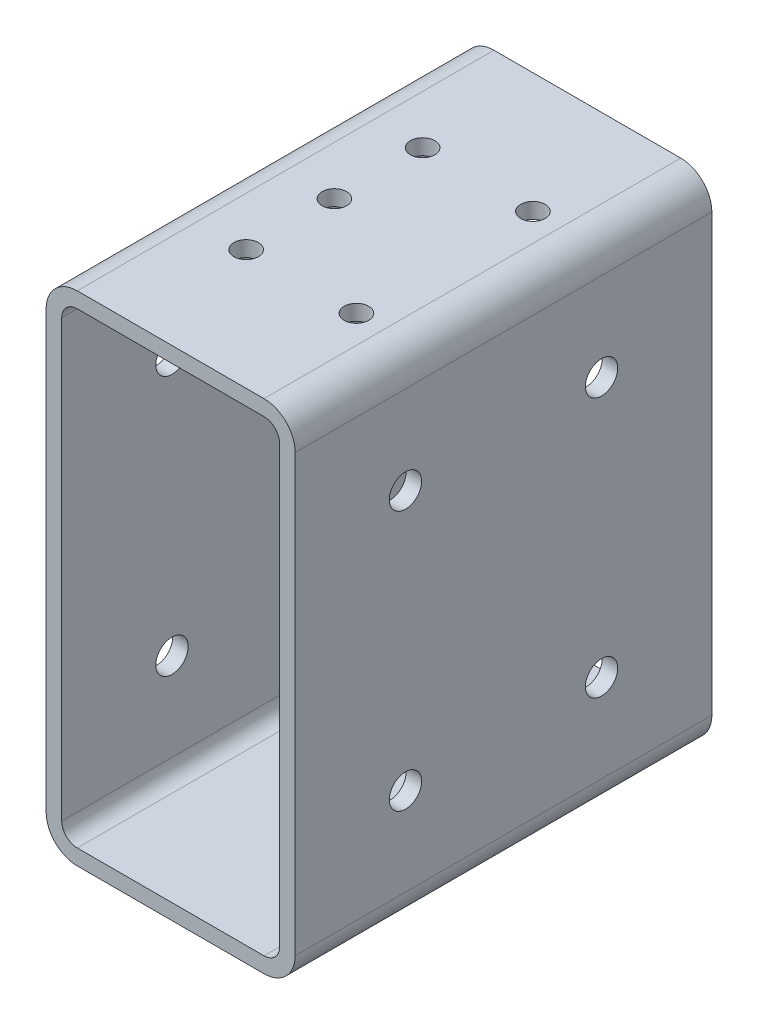
ISO-10303-21;
HEADER;
FILE_DESCRIPTION(('STEP AP214'),'2;1');
FILE_NAME('part.step','',(''),(''),'','','');
FILE_SCHEMA(('AUTOMOTIVE_DESIGN { 1 0 10303 214 1 1 1 1 }'));
ENDSEC;
DATA;
#1=APPLICATION_CONTEXT('core data for automotive mechanical design processes');
#2=APPLICATION_PROTOCOL_DEFINITION('international standard','automotive_design',2000,#1);
#3=PRODUCT_CONTEXT('',#1,'mechanical');
#4=PRODUCT('Part','Part','',(#3));
#5=PRODUCT_RELATED_PRODUCT_CATEGORY('part','',(#4));
#6=PRODUCT_DEFINITION_FORMATION('','',#4);
#7=PRODUCT_DEFINITION_CONTEXT('part definition',#1,'design');
#8=PRODUCT_DEFINITION('design','',#6,#7);
#9=PRODUCT_DEFINITION_SHAPE('','',#8);
#10=(LENGTH_UNIT() NAMED_UNIT(*) SI_UNIT(.MILLI.,.METRE.));
#11=(NAMED_UNIT(*) PLANE_ANGLE_UNIT() SI_UNIT($,.RADIAN.));
#12=(NAMED_UNIT(*) SI_UNIT($,.STERADIAN.) SOLID_ANGLE_UNIT());
#13=UNCERTAINTY_MEASURE_WITH_UNIT(LENGTH_MEASURE(1.E-05),#10,'distance_accuracy_value','');
#14=(GEOMETRIC_REPRESENTATION_CONTEXT(3) GLOBAL_UNCERTAINTY_ASSIGNED_CONTEXT((#13)) GLOBAL_UNIT_ASSIGNED_CONTEXT((#10,
#11,#12)) REPRESENTATION_CONTEXT('',''));
#15=CARTESIAN_POINT('',(0.,0.,0.));
#16=DIRECTION('',(0.,0.,1.));
#17=DIRECTION('',(1.,0.,0.));
#18=AXIS2_PLACEMENT_3D('',#15,#16,#17);
#19=CARTESIAN_POINT('',(-19.05,-44.45,-42.5));
#20=DIRECTION('',(0.,0.,1.));
#21=DIRECTION('',(1.,0.,0.));
#22=AXIS2_PLACEMENT_3D('',#19,#20,#21);
#23=CYLINDRICAL_SURFACE('',#22,3.175);
#24=CARTESIAN_POINT('',(-19.05,-44.45,42.5));
#25=DIRECTION('',(0.,0.,-1.));
#26=DIRECTION('',(-1.,0.,0.));
#27=AXIS2_PLACEMENT_3D('',#24,#25,#26);
#28=CIRCLE('',#27,3.175);
#29=CARTESIAN_POINT('',(-19.05,-47.625,42.5));
#30=VERTEX_POINT('',#29);
#31=CARTESIAN_POINT('',(-22.225,-44.45,42.5));
#32=VERTEX_POINT('',#31);
#33=EDGE_CURVE('E231',#30,#32,#28,.T.);
#34=ORIENTED_EDGE('',*,*,#33,.F.);
#35=DIRECTION('',(0.,0.,1.));
#36=VECTOR('',#35,1.);
#37=CARTESIAN_POINT('',(-19.05,-47.625,-42.5));
#38=LINE('',#37,#36);
#39=CARTESIAN_POINT('',(-19.05,-47.625,-42.5));
#40=VERTEX_POINT('',#39);
#41=EDGE_CURVE('E12',#40,#30,#38,.T.);
#42=ORIENTED_EDGE('',*,*,#41,.F.);
#43=CARTESIAN_POINT('',(-19.05,-44.45,-42.5));
#44=DIRECTION('',(0.,0.,-1.));
#45=DIRECTION('',(-1.,0.,0.));
#46=AXIS2_PLACEMENT_3D('',#43,#44,#45);
#47=CIRCLE('',#46,3.175);
#48=CARTESIAN_POINT('',(-22.225,-44.45,-42.5));
#49=VERTEX_POINT('',#48);
#50=EDGE_CURVE('E359',#40,#49,#47,.T.);
#51=ORIENTED_EDGE('',*,*,#50,.T.);
#52=DIRECTION('',(0.,0.,1.));
#53=VECTOR('',#52,1.);
#54=CARTESIAN_POINT('',(-22.225,-44.45,-42.5));
#55=LINE('',#54,#53);
#56=EDGE_CURVE('E82',#49,#32,#55,.T.);
#57=ORIENTED_EDGE('',*,*,#56,.T.);
#58=EDGE_LOOP('',(#34,#42,#51,#57));
#59=FACE_BOUND('',#58,.T.);
#60=ADVANCED_FACE('F63',(#59),#23,.F.);
#61=CARTESIAN_POINT('',(-19.05,-47.625,-42.5));
#62=DIRECTION('',(0.,1.,0.));
#63=DIRECTION('',(0.,0.,1.));
#64=AXIS2_PLACEMENT_3D('',#61,#62,#63);
#65=PLANE('',#64);
#66=DIRECTION('',(-1.,0.,0.));
#67=VECTOR('',#66,1.);
#68=CARTESIAN_POINT('',(-19.05,-47.625,42.5));
#69=LINE('',#68,#67);
#70=CARTESIAN_POINT('',(19.05,-47.625,42.5));
#71=VERTEX_POINT('',#70);
#72=EDGE_CURVE('E233',#71,#30,#69,.T.);
#73=ORIENTED_EDGE('',*,*,#72,.F.);
#74=DIRECTION('',(0.,0.,1.));
#75=VECTOR('',#74,1.);
#76=CARTESIAN_POINT('',(19.05,-47.625,-42.5));
#77=LINE('',#76,#75);
#78=CARTESIAN_POINT('',(19.05,-47.625,-42.5));
#79=VERTEX_POINT('',#78);
#80=EDGE_CURVE('E73',#79,#71,#77,.T.);
#81=ORIENTED_EDGE('',*,*,#80,.F.);
#82=DIRECTION('',(-1.,0.,0.));
#83=VECTOR('',#82,1.);
#84=CARTESIAN_POINT('',(-19.05,-47.625,-42.5));
#85=LINE('',#84,#83);
#86=EDGE_CURVE('E361',#79,#40,#85,.T.);
#87=ORIENTED_EDGE('',*,*,#86,.T.);
#88=ORIENTED_EDGE('',*,*,#41,.T.);
#89=EDGE_LOOP('',(#73,#81,#87,#88));
#90=FACE_BOUND('',#89,.T.);
#91=ADVANCED_FACE('F394',(#90),#65,.T.);
#92=CARTESIAN_POINT('',(19.05,-44.45,-42.5));
#93=DIRECTION('',(0.,0.,1.));
#94=DIRECTION('',(1.,0.,0.));
#95=AXIS2_PLACEMENT_3D('',#92,#93,#94);
#96=CYLINDRICAL_SURFACE('',#95,3.175);
#97=CARTESIAN_POINT('',(19.05,-44.45,42.5));
#98=DIRECTION('',(0.,0.,-1.));
#99=DIRECTION('',(-1.,0.,0.));
#100=AXIS2_PLACEMENT_3D('',#97,#98,#99);
#101=CIRCLE('',#100,3.175);
#102=CARTESIAN_POINT('',(22.225,-44.45,42.5));
#103=VERTEX_POINT('',#102);
#104=EDGE_CURVE('E236',#103,#71,#101,.T.);
#105=ORIENTED_EDGE('',*,*,#104,.F.);
#106=DIRECTION('',(0.,0.,1.));
#107=VECTOR('',#106,1.);
#108=CARTESIAN_POINT('',(22.225,-44.45,-42.5));
#109=LINE('',#108,#107);
#110=CARTESIAN_POINT('',(22.225,-44.45,-42.5));
#111=VERTEX_POINT('',#110);
#112=EDGE_CURVE('E258',#111,#103,#109,.T.);
#113=ORIENTED_EDGE('',*,*,#112,.F.);
#114=CARTESIAN_POINT('',(19.05,-44.45,-42.5));
#115=DIRECTION('',(0.,0.,-1.));
#116=DIRECTION('',(-1.,0.,0.));
#117=AXIS2_PLACEMENT_3D('',#114,#115,#116);
#118=CIRCLE('',#117,3.175);
#119=EDGE_CURVE('E364',#111,#79,#118,.T.);
#120=ORIENTED_EDGE('',*,*,#119,.T.);
#121=ORIENTED_EDGE('',*,*,#80,.T.);
#122=EDGE_LOOP('',(#105,#113,#120,#121));
#123=FACE_BOUND('',#122,.T.);
#124=ADVANCED_FACE('F399',(#123),#96,.F.);
#125=CARTESIAN_POINT('',(22.225,44.45,-42.5));
#126=DIRECTION('',(-1.,0.,0.));
#127=DIRECTION('',(0.,-1.,0.));
#128=AXIS2_PLACEMENT_3D('',#125,#126,#127);
#129=PLANE('',#128);
#130=CARTESIAN_POINT('',(22.225,26.5,-20.));
#131=DIRECTION('',(-1.,0.,0.));
#132=DIRECTION('',(0.,-1.,0.));
#133=AXIS2_PLACEMENT_3D('',#130,#131,#132);
#134=CIRCLE('',#133,3.3);
#135=CARTESIAN_POINT('',(22.225,23.2,-20.));
#136=VERTEX_POINT('',#135);
#137=EDGE_CURVE('E306',#136,#136,#134,.T.);
#138=ORIENTED_EDGE('',*,*,#137,.F.);
#139=EDGE_LOOP('',(#138));
#140=FACE_BOUND('',#139,.T.);
#141=CARTESIAN_POINT('',(22.225,-26.5,-20.));
#142=DIRECTION('',(-1.,0.,0.));
#143=DIRECTION('',(0.,-1.,0.));
#144=AXIS2_PLACEMENT_3D('',#141,#142,#143);
#145=CIRCLE('',#144,3.3);
#146=CARTESIAN_POINT('',(22.225,-29.8,-20.));
#147=VERTEX_POINT('',#146);
#148=EDGE_CURVE('E293',#147,#147,#145,.T.);
#149=ORIENTED_EDGE('',*,*,#148,.F.);
#150=EDGE_LOOP('',(#149));
#151=FACE_BOUND('',#150,.T.);
#152=CARTESIAN_POINT('',(22.225,-26.5,20.));
#153=DIRECTION('',(-1.,0.,0.));
#154=DIRECTION('',(0.,-1.,0.));
#155=AXIS2_PLACEMENT_3D('',#152,#153,#154);
#156=CIRCLE('',#155,3.3);
#157=CARTESIAN_POINT('',(22.225,-29.8,20.));
#158=VERTEX_POINT('',#157);
#159=EDGE_CURVE('E289',#158,#158,#156,.T.);
#160=ORIENTED_EDGE('',*,*,#159,.F.);
#161=EDGE_LOOP('',(#160));
#162=FACE_BOUND('',#161,.T.);
#163=CARTESIAN_POINT('',(22.225,26.5,20.));
#164=DIRECTION('',(-1.,0.,0.));
#165=DIRECTION('',(0.,-1.,0.));
#166=AXIS2_PLACEMENT_3D('',#163,#164,#165);
#167=CIRCLE('',#166,3.3);
#168=CARTESIAN_POINT('',(22.225,23.2,20.));
#169=VERTEX_POINT('',#168);
#170=EDGE_CURVE('E285',#169,#169,#167,.T.);
#171=ORIENTED_EDGE('',*,*,#170,.F.);
#172=EDGE_LOOP('',(#171));
#173=FACE_BOUND('',#172,.T.);
#174=DIRECTION('',(0.,-1.,0.));
#175=VECTOR('',#174,1.);
#176=CARTESIAN_POINT('',(22.225,44.45,42.5));
#177=LINE('',#176,#175);
#178=CARTESIAN_POINT('',(22.225,44.45,42.5));
#179=VERTEX_POINT('',#178);
#180=EDGE_CURVE('E239',#179,#103,#177,.T.);
#181=ORIENTED_EDGE('',*,*,#180,.F.);
#182=DIRECTION('',(0.,0.,1.));
#183=VECTOR('',#182,1.);
#184=CARTESIAN_POINT('',(22.225,44.45,-42.5));
#185=LINE('',#184,#183);
#186=CARTESIAN_POINT('',(22.225,44.45,-42.5));
#187=VERTEX_POINT('',#186);
#188=EDGE_CURVE('E256',#187,#179,#185,.T.);
#189=ORIENTED_EDGE('',*,*,#188,.F.);
#190=DIRECTION('',(0.,-1.,0.));
#191=VECTOR('',#190,1.);
#192=CARTESIAN_POINT('',(22.225,44.45,-42.5));
#193=LINE('',#192,#191);
#194=EDGE_CURVE('E367',#187,#111,#193,.T.);
#195=ORIENTED_EDGE('',*,*,#194,.T.);
#196=ORIENTED_EDGE('',*,*,#112,.T.);
#197=EDGE_LOOP('',(#181,#189,#195,#196));
#198=FACE_BOUND('',#197,.T.);
#199=ADVANCED_FACE('F542',(#140,#151,#162,#173,#198),#129,.T.);
#200=CARTESIAN_POINT('',(19.05,44.45,-42.5));
#201=DIRECTION('',(0.,0.,1.));
#202=DIRECTION('',(1.,0.,0.));
#203=AXIS2_PLACEMENT_3D('',#200,#201,#202);
#204=CYLINDRICAL_SURFACE('',#203,3.175);
#205=CARTESIAN_POINT('',(19.05,44.45,42.5));
#206=DIRECTION('',(0.,0.,-1.));
#207=DIRECTION('',(1.,0.,0.));
#208=AXIS2_PLACEMENT_3D('',#205,#206,#207);
#209=CIRCLE('',#208,3.175);
#210=CARTESIAN_POINT('',(19.05,47.625,42.5));
#211=VERTEX_POINT('',#210);
#212=EDGE_CURVE('E242',#211,#179,#209,.T.);
#213=ORIENTED_EDGE('',*,*,#212,.F.);
#214=DIRECTION('',(0.,0.,1.));
#215=VECTOR('',#214,1.);
#216=CARTESIAN_POINT('',(19.05,47.625,-42.5));
#217=LINE('',#216,#215);
#218=CARTESIAN_POINT('',(19.05,47.625,-42.5));
#219=VERTEX_POINT('',#218);
#220=EDGE_CURVE('E193',#219,#211,#217,.T.);
#221=ORIENTED_EDGE('',*,*,#220,.F.);
#222=CARTESIAN_POINT('',(19.05,44.45,-42.5));
#223=DIRECTION('',(0.,0.,-1.));
#224=DIRECTION('',(1.,0.,0.));
#225=AXIS2_PLACEMENT_3D('',#222,#223,#224);
#226=CIRCLE('',#225,3.175);
#227=EDGE_CURVE('E204',#219,#187,#226,.T.);
#228=ORIENTED_EDGE('',*,*,#227,.T.);
#229=ORIENTED_EDGE('',*,*,#188,.T.);
#230=EDGE_LOOP('',(#213,#221,#228,#229));
#231=FACE_BOUND('',#230,.T.);
#232=ADVANCED_FACE('F371',(#231),#204,.F.);
#233=CARTESIAN_POINT('',(-19.05,47.625,-42.5));
#234=DIRECTION('',(0.,-1.,0.));
#235=DIRECTION('',(1.,0.,0.));
#236=AXIS2_PLACEMENT_3D('',#233,#234,#235);
#237=PLANE('',#236);
#238=CARTESIAN_POINT('',(-9.1,47.625,-18.));
#239=DIRECTION('',(0.,-1.,0.));
#240=DIRECTION('',(1.,0.,0.));
#241=AXIS2_PLACEMENT_3D('',#238,#239,#240);
#242=CIRCLE('',#241,2.5);
#243=CARTESIAN_POINT('',(-6.6,47.625,-18.));
#244=VERTEX_POINT('',#243);
#245=EDGE_CURVE('E337',#244,#244,#242,.T.);
#246=ORIENTED_EDGE('',*,*,#245,.F.);
#247=EDGE_LOOP('',(#246));
#248=FACE_BOUND('',#247,.T.);
#249=CARTESIAN_POINT('',(-9.1,47.625,18.));
#250=DIRECTION('',(0.,-1.,0.));
#251=DIRECTION('',(1.,0.,0.));
#252=AXIS2_PLACEMENT_3D('',#249,#250,#251);
#253=CIRCLE('',#252,2.5);
#254=CARTESIAN_POINT('',(-6.6,47.625,18.));
#255=VERTEX_POINT('',#254);
#256=EDGE_CURVE('E334',#255,#255,#253,.T.);
#257=ORIENTED_EDGE('',*,*,#256,.F.);
#258=EDGE_LOOP('',(#257));
#259=FACE_BOUND('',#258,.T.);
#260=CARTESIAN_POINT('',(13.4,47.625,-18.));
#261=DIRECTION('',(0.,-1.,0.));
#262=DIRECTION('',(1.,0.,0.));
#263=AXIS2_PLACEMENT_3D('',#260,#261,#262);
#264=CIRCLE('',#263,2.49999999999999);
#265=CARTESIAN_POINT('',(15.9,47.625,-18.));
#266=VERTEX_POINT('',#265);
#267=EDGE_CURVE('E331',#266,#266,#264,.T.);
#268=ORIENTED_EDGE('',*,*,#267,.F.);
#269=EDGE_LOOP('',(#268));
#270=FACE_BOUND('',#269,.T.);
#271=CARTESIAN_POINT('',(13.4,47.625,18.));
#272=DIRECTION('',(0.,-1.,0.));
#273=DIRECTION('',(1.,0.,0.));
#274=AXIS2_PLACEMENT_3D('',#271,#272,#273);
#275=CIRCLE('',#274,2.49999999999999);
#276=CARTESIAN_POINT('',(15.9,47.625,18.));
#277=VERTEX_POINT('',#276);
#278=EDGE_CURVE('E320',#277,#277,#275,.T.);
#279=ORIENTED_EDGE('',*,*,#278,.F.);
#280=EDGE_LOOP('',(#279));
#281=FACE_BOUND('',#280,.T.);
#282=CARTESIAN_POINT('',(-9.1,47.625,0.));
#283=DIRECTION('',(0.,-1.,0.));
#284=DIRECTION('',(1.,0.,0.));
#285=AXIS2_PLACEMENT_3D('',#282,#283,#284);
#286=CIRCLE('',#285,2.5);
#287=CARTESIAN_POINT('',(-6.60000000000001,47.625,0.));
#288=VERTEX_POINT('',#287);
#289=EDGE_CURVE('E217',#288,#288,#286,.T.);
#290=ORIENTED_EDGE('',*,*,#289,.F.);
#291=EDGE_LOOP('',(#290));
#292=FACE_BOUND('',#291,.T.);
#293=DIRECTION('',(1.,0.,0.));
#294=VECTOR('',#293,1.);
#295=CARTESIAN_POINT('',(-19.05,47.625,42.5));
#296=LINE('',#295,#294);
#297=CARTESIAN_POINT('',(-19.05,47.625,42.5));
#298=VERTEX_POINT('',#297);
#299=EDGE_CURVE('E189',#298,#211,#296,.T.);
#300=ORIENTED_EDGE('',*,*,#299,.F.);
#301=DIRECTION('',(0.,0.,1.));
#302=VECTOR('',#301,1.);
#303=CARTESIAN_POINT('',(-19.05,47.625,-42.5));
#304=LINE('',#303,#302);
#305=CARTESIAN_POINT('',(-19.05,47.625,-42.5));
#306=VERTEX_POINT('',#305);
#307=EDGE_CURVE('E184',#306,#298,#304,.T.);
#308=ORIENTED_EDGE('',*,*,#307,.F.);
#309=DIRECTION('',(1.,0.,0.));
#310=VECTOR('',#309,1.);
#311=CARTESIAN_POINT('',(-19.05,47.625,-42.5));
#312=LINE('',#311,#310);
#313=EDGE_CURVE('E187',#306,#219,#312,.T.);
#314=ORIENTED_EDGE('',*,*,#313,.T.);
#315=ORIENTED_EDGE('',*,*,#220,.T.);
#316=EDGE_LOOP('',(#300,#308,#314,#315));
#317=FACE_BOUND('',#316,.T.);
#318=ADVANCED_FACE('F186',(#248,#259,#270,#281,#292,#317),#237,.T.);
#319=CARTESIAN_POINT('',(-19.05,44.45,-42.5));
#320=DIRECTION('',(0.,0.,1.));
#321=DIRECTION('',(1.,0.,0.));
#322=AXIS2_PLACEMENT_3D('',#319,#320,#321);
#323=CYLINDRICAL_SURFACE('',#322,3.17499999999999);
#324=CARTESIAN_POINT('',(-19.05,44.45,42.5));
#325=DIRECTION('',(0.,0.,-1.));
#326=DIRECTION('',(-1.,0.,0.));
#327=AXIS2_PLACEMENT_3D('',#324,#325,#326);
#328=CIRCLE('',#327,3.17499999999999);
#329=CARTESIAN_POINT('',(-22.225,44.45,42.5));
#330=VERTEX_POINT('',#329);
#331=EDGE_CURVE('E246',#330,#298,#328,.T.);
#332=ORIENTED_EDGE('',*,*,#331,.F.);
#333=DIRECTION('',(0.,0.,1.));
#334=VECTOR('',#333,1.);
#335=CARTESIAN_POINT('',(-22.225,44.45,-42.5));
#336=LINE('',#335,#334);
#337=CARTESIAN_POINT('',(-22.225,44.45,-42.5));
#338=VERTEX_POINT('',#337);
#339=EDGE_CURVE('E131',#338,#330,#336,.T.);
#340=ORIENTED_EDGE('',*,*,#339,.F.);
#341=CARTESIAN_POINT('',(-19.05,44.45,-42.5));
#342=DIRECTION('',(0.,0.,-1.));
#343=DIRECTION('',(-1.,0.,0.));
#344=AXIS2_PLACEMENT_3D('',#341,#342,#343);
#345=CIRCLE('',#344,3.17499999999999);
#346=EDGE_CURVE('E201',#338,#306,#345,.T.);
#347=ORIENTED_EDGE('',*,*,#346,.T.);
#348=ORIENTED_EDGE('',*,*,#307,.T.);
#349=EDGE_LOOP('',(#332,#340,#347,#348));
#350=FACE_BOUND('',#349,.T.);
#351=ADVANCED_FACE('F206',(#350),#323,.F.);
#352=CARTESIAN_POINT('',(-19.05,-44.45,-42.5));
#353=DIRECTION('',(0.,0.,1.));
#354=DIRECTION('',(1.,0.,0.));
#355=AXIS2_PLACEMENT_3D('',#352,#353,#354);
#356=CYLINDRICAL_SURFACE('',#355,6.35);
#357=CARTESIAN_POINT('',(-19.05,-44.45,42.5));
#358=DIRECTION('',(0.,0.,-1.));
#359=DIRECTION('',(1.,0.,0.));
#360=AXIS2_PLACEMENT_3D('',#357,#358,#359);
#361=CIRCLE('',#360,6.35);
#362=CARTESIAN_POINT('',(-19.05,-50.8,42.5));
#363=VERTEX_POINT('',#362);
#364=CARTESIAN_POINT('',(-25.4,-44.45,42.5));
#365=VERTEX_POINT('',#364);
#366=EDGE_CURVE('E213',#363,#365,#361,.T.);
#367=ORIENTED_EDGE('',*,*,#366,.T.);
#368=DIRECTION('',(0.,0.,1.));
#369=VECTOR('',#368,1.);
#370=CARTESIAN_POINT('',(-25.4,-44.45,-42.5));
#371=LINE('',#370,#369);
#372=CARTESIAN_POINT('',(-25.4,-44.45,-42.5));
#373=VERTEX_POINT('',#372);
#374=EDGE_CURVE('E253',#373,#365,#371,.T.);
#375=ORIENTED_EDGE('',*,*,#374,.F.);
#376=CARTESIAN_POINT('',(-19.05,-44.45,-42.5));
#377=DIRECTION('',(0.,0.,-1.));
#378=DIRECTION('',(1.,0.,0.));
#379=AXIS2_PLACEMENT_3D('',#376,#377,#378);
#380=CIRCLE('',#379,6.35);
#381=CARTESIAN_POINT('',(-19.05,-50.8,-42.5));
#382=VERTEX_POINT('',#381);
#383=EDGE_CURVE('E251',#382,#373,#380,.T.);
#384=ORIENTED_EDGE('',*,*,#383,.F.);
#385=DIRECTION('',(0.,0.,1.));
#386=VECTOR('',#385,1.);
#387=CARTESIAN_POINT('',(-19.05,-50.8,-42.5));
#388=LINE('',#387,#386);
#389=EDGE_CURVE('E209',#382,#363,#388,.T.);
#390=ORIENTED_EDGE('',*,*,#389,.T.);
#391=EDGE_LOOP('',(#367,#375,#384,#390));
#392=FACE_BOUND('',#391,.T.);
#393=ADVANCED_FACE('F65',(#392),#356,.T.);
#394=CARTESIAN_POINT('',(-25.4,44.45,-42.5));
#395=DIRECTION('',(1.,0.,0.));
#396=DIRECTION('',(0.,1.,0.));
#397=AXIS2_PLACEMENT_3D('',#394,#395,#396);
#398=PLANE('',#397);
#399=CARTESIAN_POINT('',(-25.4,26.5,-20.));
#400=DIRECTION('',(1.,0.,0.));
#401=DIRECTION('',(0.,1.,0.));
#402=AXIS2_PLACEMENT_3D('',#399,#400,#401);
#403=CIRCLE('',#402,3.3);
#404=CARTESIAN_POINT('',(-25.4,29.8,-20.));
#405=VERTEX_POINT('',#404);
#406=EDGE_CURVE('E290',#405,#405,#403,.T.);
#407=ORIENTED_EDGE('',*,*,#406,.T.);
#408=EDGE_LOOP('',(#407));
#409=FACE_BOUND('',#408,.T.);
#410=CARTESIAN_POINT('',(-25.4,-26.5,-20.));
#411=DIRECTION('',(1.,0.,0.));
#412=DIRECTION('',(0.,1.,0.));
#413=AXIS2_PLACEMENT_3D('',#410,#411,#412);
#414=CIRCLE('',#413,3.3);
#415=CARTESIAN_POINT('',(-25.4,-23.2,-20.));
#416=VERTEX_POINT('',#415);
#417=EDGE_CURVE('E435',#416,#416,#414,.T.);
#418=ORIENTED_EDGE('',*,*,#417,.T.);
#419=EDGE_LOOP('',(#418));
#420=FACE_BOUND('',#419,.T.);
#421=CARTESIAN_POINT('',(-25.4,-26.5,20.));
#422=DIRECTION('',(1.,0.,0.));
#423=DIRECTION('',(0.,1.,0.));
#424=AXIS2_PLACEMENT_3D('',#421,#422,#423);
#425=CIRCLE('',#424,3.3);
#426=CARTESIAN_POINT('',(-25.4,-23.2,20.));
#427=VERTEX_POINT('',#426);
#428=EDGE_CURVE('E439',#427,#427,#425,.T.);
#429=ORIENTED_EDGE('',*,*,#428,.T.);
#430=EDGE_LOOP('',(#429));
#431=FACE_BOUND('',#430,.T.);
#432=CARTESIAN_POINT('',(-25.4,26.5,20.));
#433=DIRECTION('',(1.,0.,0.));
#434=DIRECTION('',(0.,1.,0.));
#435=AXIS2_PLACEMENT_3D('',#432,#433,#434);
#436=CIRCLE('',#435,3.3);
#437=CARTESIAN_POINT('',(-25.4,29.8,20.));
#438=VERTEX_POINT('',#437);
#439=EDGE_CURVE('E286',#438,#438,#436,.T.);
#440=ORIENTED_EDGE('',*,*,#439,.T.);
#441=EDGE_LOOP('',(#440));
#442=FACE_BOUND('',#441,.T.);
#443=DIRECTION('',(0.,1.,0.));
#444=VECTOR('',#443,1.);
#445=CARTESIAN_POINT('',(-25.4,44.45,42.5));
#446=LINE('',#445,#444);
#447=CARTESIAN_POINT('',(-25.4,44.45,42.5));
#448=VERTEX_POINT('',#447);
#449=EDGE_CURVE('E216',#365,#448,#446,.T.);
#450=ORIENTED_EDGE('',*,*,#449,.T.);
#451=DIRECTION('',(0.,0.,1.));
#452=VECTOR('',#451,1.);
#453=CARTESIAN_POINT('',(-25.4,44.45,-42.5));
#454=LINE('',#453,#452);
#455=CARTESIAN_POINT('',(-25.4,44.45,-42.5));
#456=VERTEX_POINT('',#455);
#457=EDGE_CURVE('E278',#456,#448,#454,.T.);
#458=ORIENTED_EDGE('',*,*,#457,.F.);
#459=DIRECTION('',(0.,1.,0.));
#460=VECTOR('',#459,1.);
#461=CARTESIAN_POINT('',(-25.4,44.45,-42.5));
#462=LINE('',#461,#460);
#463=EDGE_CURVE('E144',#373,#456,#462,.T.);
#464=ORIENTED_EDGE('',*,*,#463,.F.);
#465=ORIENTED_EDGE('',*,*,#374,.T.);
#466=EDGE_LOOP('',(#450,#458,#464,#465));
#467=FACE_BOUND('',#466,.T.);
#468=ADVANCED_FACE('F421',(#409,#420,#431,#442,#467),#398,.F.);
#469=CARTESIAN_POINT('',(-19.05,44.45,-42.5));
#470=DIRECTION('',(0.,0.,1.));
#471=DIRECTION('',(1.,0.,0.));
#472=AXIS2_PLACEMENT_3D('',#469,#470,#471);
#473=CYLINDRICAL_SURFACE('',#472,6.35);
#474=CARTESIAN_POINT('',(-19.05,44.45,42.5));
#475=DIRECTION('',(0.,0.,-1.));
#476=DIRECTION('',(-1.,0.,0.));
#477=AXIS2_PLACEMENT_3D('',#474,#475,#476);
#478=CIRCLE('',#477,6.35);
#479=CARTESIAN_POINT('',(-19.05,50.8,42.5));
#480=VERTEX_POINT('',#479);
#481=EDGE_CURVE('E219',#448,#480,#478,.T.);
#482=ORIENTED_EDGE('',*,*,#481,.T.);
#483=DIRECTION('',(0.,0.,1.));
#484=VECTOR('',#483,1.);
#485=CARTESIAN_POINT('',(-19.05,50.8,-42.5));
#486=LINE('',#485,#484);
#487=CARTESIAN_POINT('',(-19.05,50.8,-42.5));
#488=VERTEX_POINT('',#487);
#489=EDGE_CURVE('E275',#488,#480,#486,.T.);
#490=ORIENTED_EDGE('',*,*,#489,.F.);
#491=CARTESIAN_POINT('',(-19.05,44.45,-42.5));
#492=DIRECTION('',(0.,0.,-1.));
#493=DIRECTION('',(-1.,0.,0.));
#494=AXIS2_PLACEMENT_3D('',#491,#492,#493);
#495=CIRCLE('',#494,6.35);
#496=EDGE_CURVE('E347',#456,#488,#495,.T.);
#497=ORIENTED_EDGE('',*,*,#496,.F.);
#498=ORIENTED_EDGE('',*,*,#457,.T.);
#499=EDGE_LOOP('',(#482,#490,#497,#498));
#500=FACE_BOUND('',#499,.T.);
#501=ADVANCED_FACE('F418',(#500),#473,.T.);
#502=CARTESIAN_POINT('',(-19.05,50.8,-42.5));
#503=DIRECTION('',(0.,-1.,0.));
#504=DIRECTION('',(1.,0.,0.));
#505=AXIS2_PLACEMENT_3D('',#502,#503,#504);
#506=PLANE('',#505);
#507=CARTESIAN_POINT('',(-9.1,50.8,-18.));
#508=DIRECTION('',(0.,1.,0.));
#509=DIRECTION('',(-1.,0.,0.));
#510=AXIS2_PLACEMENT_3D('',#507,#508,#509);
#511=CIRCLE('',#510,2.5);
#512=CARTESIAN_POINT('',(-11.6,50.8,-18.));
#513=VERTEX_POINT('',#512);
#514=EDGE_CURVE('E317',#513,#513,#511,.T.);
#515=ORIENTED_EDGE('',*,*,#514,.F.);
#516=EDGE_LOOP('',(#515));
#517=FACE_BOUND('',#516,.T.);
#518=CARTESIAN_POINT('',(-9.1,50.8,18.));
#519=DIRECTION('',(0.,1.,0.));
#520=DIRECTION('',(-1.,0.,0.));
#521=AXIS2_PLACEMENT_3D('',#518,#519,#520);
#522=CIRCLE('',#521,2.5);
#523=CARTESIAN_POINT('',(-11.6,50.8,18.));
#524=VERTEX_POINT('',#523);
#525=EDGE_CURVE('E321',#524,#524,#522,.T.);
#526=ORIENTED_EDGE('',*,*,#525,.F.);
#527=EDGE_LOOP('',(#526));
#528=FACE_BOUND('',#527,.T.);
#529=CARTESIAN_POINT('',(13.4,50.8,-18.));
#530=DIRECTION('',(0.,1.,0.));
#531=DIRECTION('',(-1.,0.,0.));
#532=AXIS2_PLACEMENT_3D('',#529,#530,#531);
#533=CIRCLE('',#532,2.49999999999999);
#534=CARTESIAN_POINT('',(10.9,50.8,-18.));
#535=VERTEX_POINT('',#534);
#536=EDGE_CURVE('E324',#535,#535,#533,.T.);
#537=ORIENTED_EDGE('',*,*,#536,.F.);
#538=EDGE_LOOP('',(#537));
#539=FACE_BOUND('',#538,.T.);
#540=CARTESIAN_POINT('',(13.4,50.8,18.));
#541=DIRECTION('',(0.,1.,0.));
#542=DIRECTION('',(-1.,0.,0.));
#543=AXIS2_PLACEMENT_3D('',#540,#541,#542);
#544=CIRCLE('',#543,2.49999999999999);
#545=CARTESIAN_POINT('',(10.9,50.8,18.));
#546=VERTEX_POINT('',#545);
#547=EDGE_CURVE('E316',#546,#546,#544,.T.);
#548=ORIENTED_EDGE('',*,*,#547,.F.);
#549=EDGE_LOOP('',(#548));
#550=FACE_BOUND('',#549,.T.);
#551=CARTESIAN_POINT('',(-9.1,50.8,0.));
#552=DIRECTION('',(0.,1.,0.));
#553=DIRECTION('',(-1.,0.,0.));
#554=AXIS2_PLACEMENT_3D('',#551,#552,#553);
#555=CIRCLE('',#554,2.5);
#556=CARTESIAN_POINT('',(-11.6,50.8,0.));
#557=VERTEX_POINT('',#556);
#558=EDGE_CURVE('E340',#557,#557,#555,.T.);
#559=ORIENTED_EDGE('',*,*,#558,.F.);
#560=EDGE_LOOP('',(#559));
#561=FACE_BOUND('',#560,.T.);
#562=DIRECTION('',(1.,0.,0.));
#563=VECTOR('',#562,1.);
#564=CARTESIAN_POINT('',(-19.05,50.8,42.5));
#565=LINE('',#564,#563);
#566=CARTESIAN_POINT('',(19.05,50.8,42.5));
#567=VERTEX_POINT('',#566);
#568=EDGE_CURVE('E221',#480,#567,#565,.T.);
#569=ORIENTED_EDGE('',*,*,#568,.T.);
#570=DIRECTION('',(0.,0.,1.));
#571=VECTOR('',#570,1.);
#572=CARTESIAN_POINT('',(19.05,50.8,-42.5));
#573=LINE('',#572,#571);
#574=CARTESIAN_POINT('',(19.05,50.8,-42.5));
#575=VERTEX_POINT('',#574);
#576=EDGE_CURVE('E272',#575,#567,#573,.T.);
#577=ORIENTED_EDGE('',*,*,#576,.F.);
#578=DIRECTION('',(1.,0.,0.));
#579=VECTOR('',#578,1.);
#580=CARTESIAN_POINT('',(-19.05,50.8,-42.5));
#581=LINE('',#580,#579);
#582=EDGE_CURVE('E349',#488,#575,#581,.T.);
#583=ORIENTED_EDGE('',*,*,#582,.F.);
#584=ORIENTED_EDGE('',*,*,#489,.T.);
#585=EDGE_LOOP('',(#569,#577,#583,#584));
#586=FACE_BOUND('',#585,.T.);
#587=ADVANCED_FACE('F414',(#517,#528,#539,#550,#561,#586),#506,.F.);
#588=CARTESIAN_POINT('',(19.05,44.45,-42.5));
#589=DIRECTION('',(0.,0.,1.));
#590=DIRECTION('',(1.,0.,0.));
#591=AXIS2_PLACEMENT_3D('',#588,#589,#590);
#592=CYLINDRICAL_SURFACE('',#591,6.35);
#593=CARTESIAN_POINT('',(19.05,44.45,42.5));
#594=DIRECTION('',(0.,0.,-1.));
#595=DIRECTION('',(-1.,0.,0.));
#596=AXIS2_PLACEMENT_3D('',#593,#594,#595);
#597=CIRCLE('',#596,6.35);
#598=CARTESIAN_POINT('',(25.4,44.45,42.5));
#599=VERTEX_POINT('',#598);
#600=EDGE_CURVE('E223',#567,#599,#597,.T.);
#601=ORIENTED_EDGE('',*,*,#600,.T.);
#602=DIRECTION('',(0.,0.,1.));
#603=VECTOR('',#602,1.);
#604=CARTESIAN_POINT('',(25.4,44.45,-42.5));
#605=LINE('',#604,#603);
#606=CARTESIAN_POINT('',(25.4,44.45,-42.5));
#607=VERTEX_POINT('',#606);
#608=EDGE_CURVE('E269',#607,#599,#605,.T.);
#609=ORIENTED_EDGE('',*,*,#608,.F.);
#610=CARTESIAN_POINT('',(19.05,44.45,-42.5));
#611=DIRECTION('',(0.,0.,-1.));
#612=DIRECTION('',(-1.,0.,0.));
#613=AXIS2_PLACEMENT_3D('',#610,#611,#612);
#614=CIRCLE('',#613,6.35);
#615=EDGE_CURVE('E351',#575,#607,#614,.T.);
#616=ORIENTED_EDGE('',*,*,#615,.F.);
#617=ORIENTED_EDGE('',*,*,#576,.T.);
#618=EDGE_LOOP('',(#601,#609,#616,#617));
#619=FACE_BOUND('',#618,.T.);
#620=ADVANCED_FACE('F410',(#619),#592,.T.);
#621=CARTESIAN_POINT('',(25.4,44.45,-42.5));
#622=DIRECTION('',(-1.,0.,0.));
#623=DIRECTION('',(0.,-1.,0.));
#624=AXIS2_PLACEMENT_3D('',#621,#622,#623);
#625=PLANE('',#624);
#626=CARTESIAN_POINT('',(25.4,26.5,-20.));
#627=DIRECTION('',(1.,0.,0.));
#628=DIRECTION('',(0.,1.,0.));
#629=AXIS2_PLACEMENT_3D('',#626,#627,#628);
#630=CIRCLE('',#629,3.3);
#631=CARTESIAN_POINT('',(25.4,29.8,-20.));
#632=VERTEX_POINT('',#631);
#633=EDGE_CURVE('E522',#632,#632,#630,.T.);
#634=ORIENTED_EDGE('',*,*,#633,.F.);
#635=EDGE_LOOP('',(#634));
#636=FACE_BOUND('',#635,.T.);
#637=CARTESIAN_POINT('',(25.4,-26.5,-20.));
#638=DIRECTION('',(1.,0.,0.));
#639=DIRECTION('',(0.,1.,0.));
#640=AXIS2_PLACEMENT_3D('',#637,#638,#639);
#641=CIRCLE('',#640,3.3);
#642=CARTESIAN_POINT('',(25.4,-23.2,-20.));
#643=VERTEX_POINT('',#642);
#644=EDGE_CURVE('E525',#643,#643,#641,.T.);
#645=ORIENTED_EDGE('',*,*,#644,.F.);
#646=EDGE_LOOP('',(#645));
#647=FACE_BOUND('',#646,.T.);
#648=CARTESIAN_POINT('',(25.4,-26.5,20.));
#649=DIRECTION('',(1.,0.,0.));
#650=DIRECTION('',(0.,1.,0.));
#651=AXIS2_PLACEMENT_3D('',#648,#649,#650);
#652=CIRCLE('',#651,3.3);
#653=CARTESIAN_POINT('',(25.4,-23.2,20.));
#654=VERTEX_POINT('',#653);
#655=EDGE_CURVE('E303',#654,#654,#652,.T.);
#656=ORIENTED_EDGE('',*,*,#655,.F.);
#657=EDGE_LOOP('',(#656));
#658=FACE_BOUND('',#657,.T.);
#659=CARTESIAN_POINT('',(25.4,26.5,20.));
#660=DIRECTION('',(1.,0.,0.));
#661=DIRECTION('',(0.,1.,0.));
#662=AXIS2_PLACEMENT_3D('',#659,#660,#661);
#663=CIRCLE('',#662,3.3);
#664=CARTESIAN_POINT('',(25.4,29.8,20.));
#665=VERTEX_POINT('',#664);
#666=EDGE_CURVE('E309',#665,#665,#663,.T.);
#667=ORIENTED_EDGE('',*,*,#666,.F.);
#668=EDGE_LOOP('',(#667));
#669=FACE_BOUND('',#668,.T.);
#670=DIRECTION('',(0.,-1.,0.));
#671=VECTOR('',#670,1.);
#672=CARTESIAN_POINT('',(25.4,44.45,42.5));
#673=LINE('',#672,#671);
#674=CARTESIAN_POINT('',(25.4,-44.45,42.5));
#675=VERTEX_POINT('',#674);
#676=EDGE_CURVE('E225',#599,#675,#673,.T.);
#677=ORIENTED_EDGE('',*,*,#676,.T.);
#678=DIRECTION('',(0.,0.,1.));
#679=VECTOR('',#678,1.);
#680=CARTESIAN_POINT('',(25.4,-44.45,-42.5));
#681=LINE('',#680,#679);
#682=CARTESIAN_POINT('',(25.4,-44.45,-42.5));
#683=VERTEX_POINT('',#682);
#684=EDGE_CURVE('E266',#683,#675,#681,.T.);
#685=ORIENTED_EDGE('',*,*,#684,.F.);
#686=DIRECTION('',(0.,-1.,0.));
#687=VECTOR('',#686,1.);
#688=CARTESIAN_POINT('',(25.4,44.45,-42.5));
#689=LINE('',#688,#687);
#690=EDGE_CURVE('E353',#607,#683,#689,.T.);
#691=ORIENTED_EDGE('',*,*,#690,.F.);
#692=ORIENTED_EDGE('',*,*,#608,.T.);
#693=EDGE_LOOP('',(#677,#685,#691,#692));
#694=FACE_BOUND('',#693,.T.);
#695=ADVANCED_FACE('F406',(#636,#647,#658,#669,#694),#625,.F.);
#696=CARTESIAN_POINT('',(19.05,-44.45,-42.5));
#697=DIRECTION('',(0.,0.,1.));
#698=DIRECTION('',(1.,0.,0.));
#699=AXIS2_PLACEMENT_3D('',#696,#697,#698);
#700=CYLINDRICAL_SURFACE('',#699,6.35);
#701=CARTESIAN_POINT('',(19.05,-44.45,42.5));
#702=DIRECTION('',(0.,0.,-1.));
#703=DIRECTION('',(-1.,0.,0.));
#704=AXIS2_PLACEMENT_3D('',#701,#702,#703);
#705=CIRCLE('',#704,6.35);
#706=CARTESIAN_POINT('',(19.05,-50.8,42.5));
#707=VERTEX_POINT('',#706);
#708=EDGE_CURVE('E227',#675,#707,#705,.T.);
#709=ORIENTED_EDGE('',*,*,#708,.T.);
#710=DIRECTION('',(0.,0.,1.));
#711=VECTOR('',#710,1.);
#712=CARTESIAN_POINT('',(19.05,-50.8,-42.5));
#713=LINE('',#712,#711);
#714=CARTESIAN_POINT('',(19.05,-50.8,-42.5));
#715=VERTEX_POINT('',#714);
#716=EDGE_CURVE('E263',#715,#707,#713,.T.);
#717=ORIENTED_EDGE('',*,*,#716,.F.);
#718=CARTESIAN_POINT('',(19.05,-44.45,-42.5));
#719=DIRECTION('',(0.,0.,-1.));
#720=DIRECTION('',(-1.,0.,0.));
#721=AXIS2_PLACEMENT_3D('',#718,#719,#720);
#722=CIRCLE('',#721,6.35);
#723=EDGE_CURVE('E355',#683,#715,#722,.T.);
#724=ORIENTED_EDGE('',*,*,#723,.F.);
#725=ORIENTED_EDGE('',*,*,#684,.T.);
#726=EDGE_LOOP('',(#709,#717,#724,#725));
#727=FACE_BOUND('',#726,.T.);
#728=ADVANCED_FACE('F386',(#727),#700,.T.);
#729=CARTESIAN_POINT('',(-19.05,-50.8,-42.5));
#730=DIRECTION('',(0.,1.,0.));
#731=DIRECTION('',(0.,0.,1.));
#732=AXIS2_PLACEMENT_3D('',#729,#730,#731);
#733=PLANE('',#732);
#734=DIRECTION('',(-1.,0.,0.));
#735=VECTOR('',#734,1.);
#736=CARTESIAN_POINT('',(-19.05,-50.8,42.5));
#737=LINE('',#736,#735);
#738=EDGE_CURVE('E229',#707,#363,#737,.T.);
#739=ORIENTED_EDGE('',*,*,#738,.T.);
#740=ORIENTED_EDGE('',*,*,#389,.F.);
#741=DIRECTION('',(-1.,0.,0.));
#742=VECTOR('',#741,1.);
#743=CARTESIAN_POINT('',(-19.05,-50.8,-42.5));
#744=LINE('',#743,#742);
#745=EDGE_CURVE('E357',#715,#382,#744,.T.);
#746=ORIENTED_EDGE('',*,*,#745,.F.);
#747=ORIENTED_EDGE('',*,*,#716,.T.);
#748=EDGE_LOOP('',(#739,#740,#746,#747));
#749=FACE_BOUND('',#748,.T.);
#750=ADVANCED_FACE('F377',(#749),#733,.F.);
#751=CARTESIAN_POINT('',(-22.225,44.45,-42.5));
#752=DIRECTION('',(1.,0.,0.));
#753=DIRECTION('',(0.,1.,0.));
#754=AXIS2_PLACEMENT_3D('',#751,#752,#753);
#755=PLANE('',#754);
#756=CARTESIAN_POINT('',(-22.225,26.5,-20.));
#757=DIRECTION('',(1.,0.,0.));
#758=DIRECTION('',(0.,1.,0.));
#759=AXIS2_PLACEMENT_3D('',#756,#757,#758);
#760=CIRCLE('',#759,3.3);
#761=CARTESIAN_POINT('',(-22.225,29.8,-20.));
#762=VERTEX_POINT('',#761);
#763=EDGE_CURVE('E67',#762,#762,#760,.T.);
#764=ORIENTED_EDGE('',*,*,#763,.F.);
#765=EDGE_LOOP('',(#764));
#766=FACE_BOUND('',#765,.T.);
#767=CARTESIAN_POINT('',(-22.225,-26.5,-20.));
#768=DIRECTION('',(1.,0.,0.));
#769=DIRECTION('',(0.,1.,0.));
#770=AXIS2_PLACEMENT_3D('',#767,#768,#769);
#771=CIRCLE('',#770,3.3);
#772=CARTESIAN_POINT('',(-22.225,-23.2,-20.));
#773=VERTEX_POINT('',#772);
#774=EDGE_CURVE('E291',#773,#773,#771,.T.);
#775=ORIENTED_EDGE('',*,*,#774,.F.);
#776=EDGE_LOOP('',(#775));
#777=FACE_BOUND('',#776,.T.);
#778=CARTESIAN_POINT('',(-22.225,-26.5,20.));
#779=DIRECTION('',(1.,0.,0.));
#780=DIRECTION('',(0.,1.,0.));
#781=AXIS2_PLACEMENT_3D('',#778,#779,#780);
#782=CIRCLE('',#781,3.3);
#783=CARTESIAN_POINT('',(-22.225,-23.2,20.));
#784=VERTEX_POINT('',#783);
#785=EDGE_CURVE('E287',#784,#784,#782,.T.);
#786=ORIENTED_EDGE('',*,*,#785,.F.);
#787=EDGE_LOOP('',(#786));
#788=FACE_BOUND('',#787,.T.);
#789=CARTESIAN_POINT('',(-22.225,26.5,20.));
#790=DIRECTION('',(1.,0.,0.));
#791=DIRECTION('',(0.,1.,0.));
#792=AXIS2_PLACEMENT_3D('',#789,#790,#791);
#793=CIRCLE('',#792,3.3);
#794=CARTESIAN_POINT('',(-22.225,29.8,20.));
#795=VERTEX_POINT('',#794);
#796=EDGE_CURVE('E282',#795,#795,#793,.T.);
#797=ORIENTED_EDGE('',*,*,#796,.F.);
#798=EDGE_LOOP('',(#797));
#799=FACE_BOUND('',#798,.T.);
#800=DIRECTION('',(0.,1.,0.));
#801=VECTOR('',#800,1.);
#802=CARTESIAN_POINT('',(-22.225,44.45,42.5));
#803=LINE('',#802,#801);
#804=EDGE_CURVE('E248',#32,#330,#803,.T.);
#805=ORIENTED_EDGE('',*,*,#804,.F.);
#806=ORIENTED_EDGE('',*,*,#56,.F.);
#807=DIRECTION('',(0.,1.,0.));
#808=VECTOR('',#807,1.);
#809=CARTESIAN_POINT('',(-22.225,44.45,-42.5));
#810=LINE('',#809,#808);
#811=EDGE_CURVE('E207',#49,#338,#810,.T.);
#812=ORIENTED_EDGE('',*,*,#811,.T.);
#813=ORIENTED_EDGE('',*,*,#339,.T.);
#814=EDGE_LOOP('',(#805,#806,#812,#813));
#815=FACE_BOUND('',#814,.T.);
#816=ADVANCED_FACE('F375',(#766,#777,#788,#799,#815),#755,.T.);
#817=CARTESIAN_POINT('',(-19.05,-44.45,-42.5));
#818=DIRECTION('',(0.,0.,1.));
#819=DIRECTION('',(1.,0.,0.));
#820=AXIS2_PLACEMENT_3D('',#817,#818,#819);
#821=PLANE('',#820);
#822=ORIENTED_EDGE('',*,*,#383,.T.);
#823=ORIENTED_EDGE('',*,*,#463,.T.);
#824=ORIENTED_EDGE('',*,*,#496,.T.);
#825=ORIENTED_EDGE('',*,*,#582,.T.);
#826=ORIENTED_EDGE('',*,*,#615,.T.);
#827=ORIENTED_EDGE('',*,*,#690,.T.);
#828=ORIENTED_EDGE('',*,*,#723,.T.);
#829=ORIENTED_EDGE('',*,*,#745,.T.);
#830=EDGE_LOOP('',(#822,#823,#824,#825,#826,#827,#828,#829));
#831=FACE_BOUND('',#830,.T.);
#832=ORIENTED_EDGE('',*,*,#50,.F.);
#833=ORIENTED_EDGE('',*,*,#86,.F.);
#834=ORIENTED_EDGE('',*,*,#119,.F.);
#835=ORIENTED_EDGE('',*,*,#194,.F.);
#836=ORIENTED_EDGE('',*,*,#227,.F.);
#837=ORIENTED_EDGE('',*,*,#313,.F.);
#838=ORIENTED_EDGE('',*,*,#346,.F.);
#839=ORIENTED_EDGE('',*,*,#811,.F.);
#840=EDGE_LOOP('',(#832,#833,#834,#835,#836,#837,#838,#839));
#841=FACE_BOUND('',#840,.T.);
#842=ADVANCED_FACE('F199',(#831,#841),#821,.F.);
#843=CARTESIAN_POINT('',(-19.05,-44.45,42.5));
#844=DIRECTION('',(0.,0.,1.));
#845=DIRECTION('',(1.,0.,0.));
#846=AXIS2_PLACEMENT_3D('',#843,#844,#845);
#847=PLANE('',#846);
#848=ORIENTED_EDGE('',*,*,#366,.F.);
#849=ORIENTED_EDGE('',*,*,#738,.F.);
#850=ORIENTED_EDGE('',*,*,#708,.F.);
#851=ORIENTED_EDGE('',*,*,#676,.F.);
#852=ORIENTED_EDGE('',*,*,#600,.F.);
#853=ORIENTED_EDGE('',*,*,#568,.F.);
#854=ORIENTED_EDGE('',*,*,#481,.F.);
#855=ORIENTED_EDGE('',*,*,#449,.F.);
#856=EDGE_LOOP('',(#848,#849,#850,#851,#852,#853,#854,#855));
#857=FACE_BOUND('',#856,.T.);
#858=ORIENTED_EDGE('',*,*,#33,.T.);
#859=ORIENTED_EDGE('',*,*,#804,.T.);
#860=ORIENTED_EDGE('',*,*,#331,.T.);
#861=ORIENTED_EDGE('',*,*,#299,.T.);
#862=ORIENTED_EDGE('',*,*,#212,.T.);
#863=ORIENTED_EDGE('',*,*,#180,.T.);
#864=ORIENTED_EDGE('',*,*,#104,.T.);
#865=ORIENTED_EDGE('',*,*,#72,.T.);
#866=EDGE_LOOP('',(#858,#859,#860,#861,#862,#863,#864,#865));
#867=FACE_BOUND('',#866,.T.);
#868=ADVANCED_FACE('F374',(#857,#867),#847,.T.);
#869=CARTESIAN_POINT('',(-9.1,40.8,0.));
#870=DIRECTION('',(0.,1.,0.));
#871=DIRECTION('',(-1.,0.,0.));
#872=AXIS2_PLACEMENT_3D('',#869,#870,#871);
#873=CYLINDRICAL_SURFACE('',#872,2.5);
#874=ORIENTED_EDGE('',*,*,#289,.T.);
#875=EDGE_LOOP('',(#874));
#876=FACE_BOUND('',#875,.T.);
#877=ORIENTED_EDGE('',*,*,#558,.T.);
#878=EDGE_LOOP('',(#877));
#879=FACE_BOUND('',#878,.T.);
#880=ADVANCED_FACE('F466',(#876,#879),#873,.F.);
#881=CARTESIAN_POINT('',(13.4,40.8,18.));
#882=DIRECTION('',(0.,1.,0.));
#883=DIRECTION('',(-1.,0.,0.));
#884=AXIS2_PLACEMENT_3D('',#881,#882,#883);
#885=CYLINDRICAL_SURFACE('',#884,2.49999999999999);
#886=ORIENTED_EDGE('',*,*,#278,.T.);
#887=EDGE_LOOP('',(#886));
#888=FACE_BOUND('',#887,.T.);
#889=ORIENTED_EDGE('',*,*,#547,.T.);
#890=EDGE_LOOP('',(#889));
#891=FACE_BOUND('',#890,.T.);
#892=ADVANCED_FACE('F470',(#888,#891),#885,.F.);
#893=CARTESIAN_POINT('',(13.4,40.8,-18.));
#894=DIRECTION('',(0.,1.,0.));
#895=DIRECTION('',(-1.,0.,0.));
#896=AXIS2_PLACEMENT_3D('',#893,#894,#895);
#897=CYLINDRICAL_SURFACE('',#896,2.49999999999999);
#898=ORIENTED_EDGE('',*,*,#267,.T.);
#899=EDGE_LOOP('',(#898));
#900=FACE_BOUND('',#899,.T.);
#901=ORIENTED_EDGE('',*,*,#536,.T.);
#902=EDGE_LOOP('',(#901));
#903=FACE_BOUND('',#902,.T.);
#904=ADVANCED_FACE('F476',(#900,#903),#897,.F.);
#905=CARTESIAN_POINT('',(-9.1,40.8,18.));
#906=DIRECTION('',(0.,1.,0.));
#907=DIRECTION('',(-1.,0.,0.));
#908=AXIS2_PLACEMENT_3D('',#905,#906,#907);
#909=CYLINDRICAL_SURFACE('',#908,2.5);
#910=ORIENTED_EDGE('',*,*,#256,.T.);
#911=EDGE_LOOP('',(#910));
#912=FACE_BOUND('',#911,.T.);
#913=ORIENTED_EDGE('',*,*,#525,.T.);
#914=EDGE_LOOP('',(#913));
#915=FACE_BOUND('',#914,.T.);
#916=ADVANCED_FACE('F480',(#912,#915),#909,.F.);
#917=CARTESIAN_POINT('',(-9.1,40.8,-18.));
#918=DIRECTION('',(0.,1.,0.));
#919=DIRECTION('',(-1.,0.,0.));
#920=AXIS2_PLACEMENT_3D('',#917,#918,#919);
#921=CYLINDRICAL_SURFACE('',#920,2.5);
#922=ORIENTED_EDGE('',*,*,#245,.T.);
#923=EDGE_LOOP('',(#922));
#924=FACE_BOUND('',#923,.T.);
#925=ORIENTED_EDGE('',*,*,#514,.T.);
#926=EDGE_LOOP('',(#925));
#927=FACE_BOUND('',#926,.T.);
#928=ADVANCED_FACE('F484',(#924,#927),#921,.F.);
#929=CARTESIAN_POINT('',(-25.4,26.5,20.));
#930=DIRECTION('',(1.,0.,0.));
#931=DIRECTION('',(0.,1.,0.));
#932=AXIS2_PLACEMENT_3D('',#929,#930,#931);
#933=CYLINDRICAL_SURFACE('',#932,3.3);
#934=ORIENTED_EDGE('',*,*,#796,.T.);
#935=EDGE_LOOP('',(#934));
#936=FACE_BOUND('',#935,.T.);
#937=ORIENTED_EDGE('',*,*,#439,.F.);
#938=EDGE_LOOP('',(#937));
#939=FACE_BOUND('',#938,.T.);
#940=ADVANCED_FACE('F488',(#936,#939),#933,.F.);
#941=ORIENTED_EDGE('',*,*,#170,.T.);
#942=EDGE_LOOP('',(#941));
#943=FACE_BOUND('',#942,.T.);
#944=ORIENTED_EDGE('',*,*,#666,.T.);
#945=EDGE_LOOP('',(#944));
#946=FACE_BOUND('',#945,.T.);
#947=ADVANCED_FACE('F492',(#943,#946),#933,.F.);
#948=CARTESIAN_POINT('',(-25.4,-26.5,20.));
#949=DIRECTION('',(1.,0.,0.));
#950=DIRECTION('',(0.,1.,0.));
#951=AXIS2_PLACEMENT_3D('',#948,#949,#950);
#952=CYLINDRICAL_SURFACE('',#951,3.3);
#953=ORIENTED_EDGE('',*,*,#785,.T.);
#954=EDGE_LOOP('',(#953));
#955=FACE_BOUND('',#954,.T.);
#956=ORIENTED_EDGE('',*,*,#428,.F.);
#957=EDGE_LOOP('',(#956));
#958=FACE_BOUND('',#957,.T.);
#959=ADVANCED_FACE('F494',(#955,#958),#952,.F.);
#960=CARTESIAN_POINT('',(-25.4,-26.5,-20.));
#961=DIRECTION('',(1.,0.,0.));
#962=DIRECTION('',(0.,1.,0.));
#963=AXIS2_PLACEMENT_3D('',#960,#961,#962);
#964=CYLINDRICAL_SURFACE('',#963,3.3);
#965=ORIENTED_EDGE('',*,*,#774,.T.);
#966=EDGE_LOOP('',(#965));
#967=FACE_BOUND('',#966,.T.);
#968=ORIENTED_EDGE('',*,*,#417,.F.);
#969=EDGE_LOOP('',(#968));
#970=FACE_BOUND('',#969,.T.);
#971=ADVANCED_FACE('F497',(#967,#970),#964,.F.);
#972=CARTESIAN_POINT('',(-25.4,26.5,-20.));
#973=DIRECTION('',(1.,0.,0.));
#974=DIRECTION('',(0.,1.,0.));
#975=AXIS2_PLACEMENT_3D('',#972,#973,#974);
#976=CYLINDRICAL_SURFACE('',#975,3.3);
#977=ORIENTED_EDGE('',*,*,#763,.T.);
#978=EDGE_LOOP('',(#977));
#979=FACE_BOUND('',#978,.T.);
#980=ORIENTED_EDGE('',*,*,#406,.F.);
#981=EDGE_LOOP('',(#980));
#982=FACE_BOUND('',#981,.T.);
#983=ADVANCED_FACE('F502',(#979,#982),#976,.F.);
#984=ORIENTED_EDGE('',*,*,#159,.T.);
#985=EDGE_LOOP('',(#984));
#986=FACE_BOUND('',#985,.T.);
#987=ORIENTED_EDGE('',*,*,#655,.T.);
#988=EDGE_LOOP('',(#987));
#989=FACE_BOUND('',#988,.T.);
#990=ADVANCED_FACE('F499',(#986,#989),#952,.F.);
#991=ORIENTED_EDGE('',*,*,#148,.T.);
#992=EDGE_LOOP('',(#991));
#993=FACE_BOUND('',#992,.T.);
#994=ORIENTED_EDGE('',*,*,#644,.T.);
#995=EDGE_LOOP('',(#994));
#996=FACE_BOUND('',#995,.T.);
#997=ADVANCED_FACE('F503',(#993,#996),#964,.F.);
#998=ORIENTED_EDGE('',*,*,#137,.T.);
#999=EDGE_LOOP('',(#998));
#1000=FACE_BOUND('',#999,.T.);
#1001=ORIENTED_EDGE('',*,*,#633,.T.);
#1002=EDGE_LOOP('',(#1001));
#1003=FACE_BOUND('',#1002,.T.);
#1004=ADVANCED_FACE('F506',(#1000,#1003),#976,.F.);
#1005=CLOSED_SHELL('',(#60,#91,#124,#199,#232,#318,#351,#393,#468,#501,#587,#620,#695,#728,#750,
#816,#842,#868,#880,#892,#904,#916,#928,#940,#947,#959,#971,#983,#990,#997,#1004));
#1006=MANIFOLD_SOLID_BREP('B2',#1005);
#1007=ADVANCED_BREP_SHAPE_REPRESENTATION('',(#18,#1006),#14);
#1008=SHAPE_DEFINITION_REPRESENTATION(#9,#1007);
ENDSEC;
END-ISO-10303-21;
